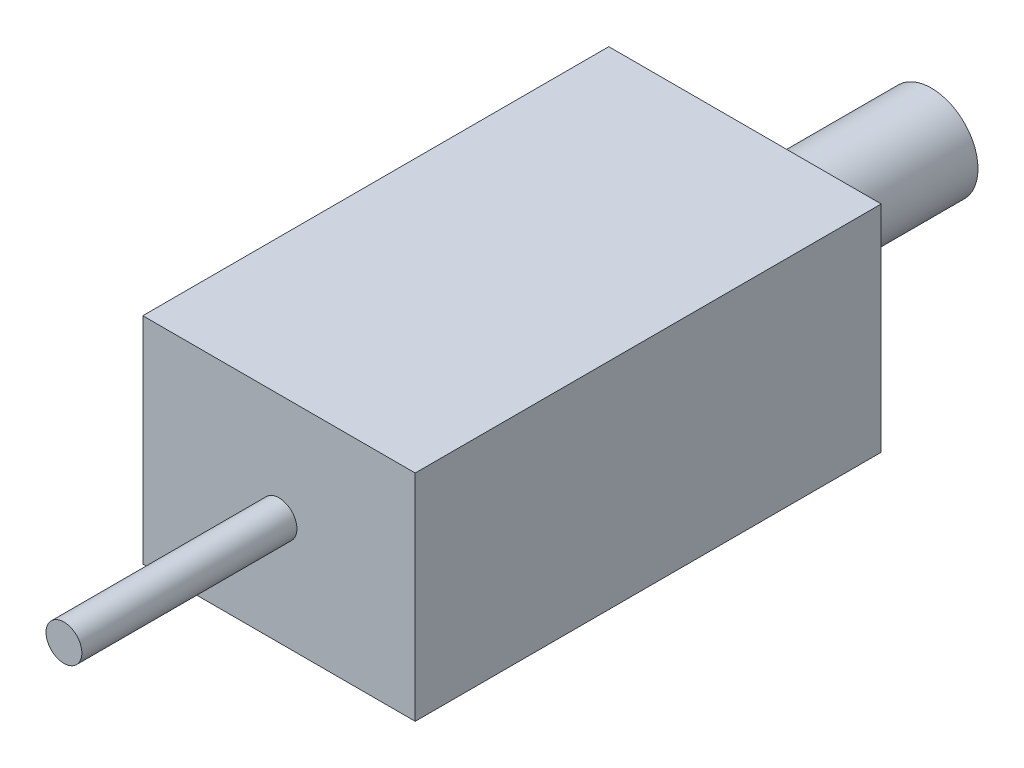
ISO-10303-21;
HEADER;
FILE_DESCRIPTION(('STEP AP214'),'2;1');
FILE_NAME('part.step','',(''),(''),'','','');
FILE_SCHEMA(('AUTOMOTIVE_DESIGN { 1 0 10303 214 1 1 1 1 }'));
ENDSEC;
DATA;
#1=APPLICATION_CONTEXT('core data for automotive mechanical design processes');
#2=APPLICATION_PROTOCOL_DEFINITION('international standard','automotive_design',2000,#1);
#3=PRODUCT_CONTEXT('',#1,'mechanical');
#4=PRODUCT('Part','Part','',(#3));
#5=PRODUCT_RELATED_PRODUCT_CATEGORY('part','',(#4));
#6=PRODUCT_DEFINITION_FORMATION('','',#4);
#7=PRODUCT_DEFINITION_CONTEXT('part definition',#1,'design');
#8=PRODUCT_DEFINITION('design','',#6,#7);
#9=PRODUCT_DEFINITION_SHAPE('','',#8);
#10=(LENGTH_UNIT() NAMED_UNIT(*) SI_UNIT(.MILLI.,.METRE.));
#11=(NAMED_UNIT(*) PLANE_ANGLE_UNIT() SI_UNIT($,.RADIAN.));
#12=(NAMED_UNIT(*) SI_UNIT($,.STERADIAN.) SOLID_ANGLE_UNIT());
#13=UNCERTAINTY_MEASURE_WITH_UNIT(LENGTH_MEASURE(1.E-05),#10,'distance_accuracy_value','');
#14=(GEOMETRIC_REPRESENTATION_CONTEXT(3) GLOBAL_UNCERTAINTY_ASSIGNED_CONTEXT((#13)) GLOBAL_UNIT_ASSIGNED_CONTEXT((#10,
#11,#12)) REPRESENTATION_CONTEXT('',''));
#15=CARTESIAN_POINT('',(0.,0.,0.));
#16=DIRECTION('',(0.,0.,1.));
#17=DIRECTION('',(1.,0.,0.));
#18=AXIS2_PLACEMENT_3D('',#15,#16,#17);
#19=CARTESIAN_POINT('',(19.,-15.,65.));
#20=DIRECTION('',(-1.,0.,0.));
#21=DIRECTION('',(0.,0.,1.));
#22=AXIS2_PLACEMENT_3D('',#19,#20,#21);
#23=PLANE('',#22);
#24=DIRECTION('',(0.,1.,0.));
#25=VECTOR('',#24,1.);
#26=CARTESIAN_POINT('',(19.,-15.,0.));
#27=LINE('',#26,#25);
#28=CARTESIAN_POINT('',(19.,-15.,0.));
#29=VERTEX_POINT('',#28);
#30=CARTESIAN_POINT('',(19.,15.,0.));
#31=VERTEX_POINT('',#30);
#32=EDGE_CURVE('E99',#29,#31,#27,.T.);
#33=ORIENTED_EDGE('',*,*,#32,.T.);
#34=DIRECTION('',(0.,0.,-1.));
#35=VECTOR('',#34,1.);
#36=CARTESIAN_POINT('',(19.,15.,65.));
#37=LINE('',#36,#35);
#38=CARTESIAN_POINT('',(19.,15.,65.));
#39=VERTEX_POINT('',#38);
#40=EDGE_CURVE('E41',#39,#31,#37,.T.);
#41=ORIENTED_EDGE('',*,*,#40,.F.);
#42=DIRECTION('',(0.,1.,0.));
#43=VECTOR('',#42,1.);
#44=CARTESIAN_POINT('',(19.,-15.,65.));
#45=LINE('',#44,#43);
#46=CARTESIAN_POINT('',(19.,-15.,65.));
#47=VERTEX_POINT('',#46);
#48=EDGE_CURVE('E85',#47,#39,#45,.T.);
#49=ORIENTED_EDGE('',*,*,#48,.F.);
#50=DIRECTION('',(0.,0.,-1.));
#51=VECTOR('',#50,1.);
#52=CARTESIAN_POINT('',(19.,-15.,65.));
#53=LINE('',#52,#51);
#54=EDGE_CURVE('E95',#47,#29,#53,.T.);
#55=ORIENTED_EDGE('',*,*,#54,.T.);
#56=EDGE_LOOP('',(#33,#41,#49,#55));
#57=FACE_BOUND('',#56,.T.);
#58=ADVANCED_FACE('F33',(#57),#23,.F.);
#59=CARTESIAN_POINT('',(-19.,15.,65.));
#60=DIRECTION('',(0.,-1.,0.));
#61=DIRECTION('',(0.,0.,-1.));
#62=AXIS2_PLACEMENT_3D('',#59,#60,#61);
#63=PLANE('',#62);
#64=DIRECTION('',(-1.,0.,0.));
#65=VECTOR('',#64,1.);
#66=CARTESIAN_POINT('',(-19.,15.,0.));
#67=LINE('',#66,#65);
#68=CARTESIAN_POINT('',(-19.,15.,0.));
#69=VERTEX_POINT('',#68);
#70=EDGE_CURVE('E90',#31,#69,#67,.T.);
#71=ORIENTED_EDGE('',*,*,#70,.T.);
#72=DIRECTION('',(0.,0.,-1.));
#73=VECTOR('',#72,1.);
#74=CARTESIAN_POINT('',(-19.,15.,65.));
#75=LINE('',#74,#73);
#76=CARTESIAN_POINT('',(-19.,15.,65.));
#77=VERTEX_POINT('',#76);
#78=EDGE_CURVE('E88',#77,#69,#75,.T.);
#79=ORIENTED_EDGE('',*,*,#78,.F.);
#80=DIRECTION('',(-1.,0.,0.));
#81=VECTOR('',#80,1.);
#82=CARTESIAN_POINT('',(-19.,15.,65.));
#83=LINE('',#82,#81);
#84=EDGE_CURVE('E80',#39,#77,#83,.T.);
#85=ORIENTED_EDGE('',*,*,#84,.F.);
#86=ORIENTED_EDGE('',*,*,#40,.T.);
#87=EDGE_LOOP('',(#71,#79,#85,#86));
#88=FACE_BOUND('',#87,.T.);
#89=ADVANCED_FACE('F89',(#88),#63,.F.);
#90=CARTESIAN_POINT('',(-19.,-15.,65.));
#91=DIRECTION('',(1.,0.,0.));
#92=DIRECTION('',(0.,0.,-1.));
#93=AXIS2_PLACEMENT_3D('',#90,#91,#92);
#94=PLANE('',#93);
#95=DIRECTION('',(0.,-1.,0.));
#96=VECTOR('',#95,1.);
#97=CARTESIAN_POINT('',(-19.,-15.,0.));
#98=LINE('',#97,#96);
#99=CARTESIAN_POINT('',(-19.,-15.,0.));
#100=VERTEX_POINT('',#99);
#101=EDGE_CURVE('E66',#69,#100,#98,.T.);
#102=ORIENTED_EDGE('',*,*,#101,.T.);
#103=DIRECTION('',(0.,0.,-1.));
#104=VECTOR('',#103,1.);
#105=CARTESIAN_POINT('',(-19.,-15.,65.));
#106=LINE('',#105,#104);
#107=CARTESIAN_POINT('',(-19.,-15.,65.));
#108=VERTEX_POINT('',#107);
#109=EDGE_CURVE('E91',#108,#100,#106,.T.);
#110=ORIENTED_EDGE('',*,*,#109,.F.);
#111=DIRECTION('',(0.,-1.,0.));
#112=VECTOR('',#111,1.);
#113=CARTESIAN_POINT('',(-19.,-15.,65.));
#114=LINE('',#113,#112);
#115=EDGE_CURVE('E83',#77,#108,#114,.T.);
#116=ORIENTED_EDGE('',*,*,#115,.F.);
#117=ORIENTED_EDGE('',*,*,#78,.T.);
#118=EDGE_LOOP('',(#102,#110,#116,#117));
#119=FACE_BOUND('',#118,.T.);
#120=ADVANCED_FACE('F93',(#119),#94,.F.);
#121=CARTESIAN_POINT('',(-19.,-15.,65.));
#122=DIRECTION('',(0.,1.,0.));
#123=DIRECTION('',(0.,0.,1.));
#124=AXIS2_PLACEMENT_3D('',#121,#122,#123);
#125=PLANE('',#124);
#126=DIRECTION('',(1.,0.,0.));
#127=VECTOR('',#126,1.);
#128=CARTESIAN_POINT('',(-19.,-15.,0.));
#129=LINE('',#128,#127);
#130=EDGE_CURVE('E72',#100,#29,#129,.T.);
#131=ORIENTED_EDGE('',*,*,#130,.T.);
#132=ORIENTED_EDGE('',*,*,#54,.F.);
#133=DIRECTION('',(1.,0.,0.));
#134=VECTOR('',#133,1.);
#135=CARTESIAN_POINT('',(-19.,-15.,65.));
#136=LINE('',#135,#134);
#137=EDGE_CURVE('E49',#108,#47,#136,.T.);
#138=ORIENTED_EDGE('',*,*,#137,.F.);
#139=ORIENTED_EDGE('',*,*,#109,.T.);
#140=EDGE_LOOP('',(#131,#132,#138,#139));
#141=FACE_BOUND('',#140,.T.);
#142=ADVANCED_FACE('F122',(#141),#125,.F.);
#143=CARTESIAN_POINT('',(0.,0.,65.));
#144=DIRECTION('',(0.,0.,-1.));
#145=DIRECTION('',(-1.,0.,0.));
#146=AXIS2_PLACEMENT_3D('',#143,#144,#145);
#147=PLANE('',#146);
#148=CARTESIAN_POINT('',(0.,0.,65.));
#149=DIRECTION('',(0.,0.,-1.));
#150=DIRECTION('',(-1.,0.,0.));
#151=AXIS2_PLACEMENT_3D('',#148,#149,#150);
#152=CIRCLE('',#151,2.5);
#153=CARTESIAN_POINT('',(-2.5,0.,65.));
#154=VERTEX_POINT('',#153);
#155=EDGE_CURVE('E11',#154,#154,#152,.F.);
#156=ORIENTED_EDGE('',*,*,#155,.F.);
#157=EDGE_LOOP('',(#156));
#158=FACE_BOUND('',#157,.T.);
#159=ORIENTED_EDGE('',*,*,#48,.T.);
#160=ORIENTED_EDGE('',*,*,#84,.T.);
#161=ORIENTED_EDGE('',*,*,#115,.T.);
#162=ORIENTED_EDGE('',*,*,#137,.T.);
#163=EDGE_LOOP('',(#159,#160,#161,#162));
#164=FACE_BOUND('',#163,.T.);
#165=ADVANCED_FACE('F81',(#158,#164),#147,.F.);
#166=CARTESIAN_POINT('',(0.,0.,0.));
#167=DIRECTION('',(0.,0.,-1.));
#168=DIRECTION('',(-1.,0.,0.));
#169=AXIS2_PLACEMENT_3D('',#166,#167,#168);
#170=PLANE('',#169);
#171=CARTESIAN_POINT('',(0.,0.,0.));
#172=DIRECTION('',(0.,0.,-1.));
#173=DIRECTION('',(-1.,0.,0.));
#174=AXIS2_PLACEMENT_3D('',#171,#172,#173);
#175=CIRCLE('',#174,6.5);
#176=CARTESIAN_POINT('',(6.5,0.,0.));
#177=VERTEX_POINT('',#176);
#178=EDGE_CURVE('E190',#177,#177,#175,.T.);
#179=ORIENTED_EDGE('',*,*,#178,.F.);
#180=EDGE_LOOP('',(#179));
#181=FACE_BOUND('',#180,.T.);
#182=ORIENTED_EDGE('',*,*,#32,.F.);
#183=ORIENTED_EDGE('',*,*,#130,.F.);
#184=ORIENTED_EDGE('',*,*,#101,.F.);
#185=ORIENTED_EDGE('',*,*,#70,.F.);
#186=EDGE_LOOP('',(#182,#183,#184,#185));
#187=FACE_BOUND('',#186,.T.);
#188=ADVANCED_FACE('F110',(#181,#187),#170,.T.);
#189=CARTESIAN_POINT('',(0.,0.,95.));
#190=DIRECTION('',(0.,0.,-1.));
#191=DIRECTION('',(-1.,0.,0.));
#192=AXIS2_PLACEMENT_3D('',#189,#190,#191);
#193=CYLINDRICAL_SURFACE('',#192,2.5);
#194=CARTESIAN_POINT('',(0.,0.,95.));
#195=DIRECTION('',(0.,0.,1.));
#196=DIRECTION('',(1.,0.,0.));
#197=AXIS2_PLACEMENT_3D('',#194,#195,#196);
#198=CIRCLE('',#197,2.5);
#199=CARTESIAN_POINT('',(2.5,0.,95.));
#200=VERTEX_POINT('',#199);
#201=EDGE_CURVE('E102',#200,#200,#198,.T.);
#202=ORIENTED_EDGE('',*,*,#201,.F.);
#203=EDGE_LOOP('',(#202));
#204=FACE_BOUND('',#203,.T.);
#205=ORIENTED_EDGE('',*,*,#155,.T.);
#206=EDGE_LOOP('',(#205));
#207=FACE_BOUND('',#206,.T.);
#208=ADVANCED_FACE('F112',(#204,#207),#193,.T.);
#209=CARTESIAN_POINT('',(0.,0.,95.));
#210=DIRECTION('',(0.,0.,1.));
#211=DIRECTION('',(1.,0.,0.));
#212=AXIS2_PLACEMENT_3D('',#209,#210,#211);
#213=PLANE('',#212);
#214=ORIENTED_EDGE('',*,*,#201,.T.);
#215=EDGE_LOOP('',(#214));
#216=FACE_BOUND('',#215,.T.);
#217=ADVANCED_FACE('F119',(#216),#213,.T.);
#218=CARTESIAN_POINT('',(0.,0.,-26.));
#219=DIRECTION('',(0.,0.,1.));
#220=DIRECTION('',(1.,0.,0.));
#221=AXIS2_PLACEMENT_3D('',#218,#219,#220);
#222=CYLINDRICAL_SURFACE('',#221,6.5);
#223=CARTESIAN_POINT('',(0.,0.,-26.));
#224=DIRECTION('',(0.,0.,-1.));
#225=DIRECTION('',(-1.,0.,0.));
#226=AXIS2_PLACEMENT_3D('',#223,#224,#225);
#227=CIRCLE('',#226,6.5);
#228=CARTESIAN_POINT('',(6.5,0.,-26.));
#229=VERTEX_POINT('',#228);
#230=EDGE_CURVE('E189',#229,#229,#227,.T.);
#231=CARTESIAN_POINT('',(6.5,0.,-26.));
#232=CARTESIAN_POINT('',(6.5,0.,-25.7291666666667));
#233=CARTESIAN_POINT('',(6.5,0.,-25.4583333333333));
#234=CARTESIAN_POINT('',(6.5,0.,-24.9166666666667));
#235=CARTESIAN_POINT('',(6.5,0.,-24.6458333333333));
#236=CARTESIAN_POINT('',(6.5,0.,-24.1041666666667));
#237=CARTESIAN_POINT('',(6.5,0.,-23.8333333333333));
#238=CARTESIAN_POINT('',(6.5,0.,-23.2916666666667));
#239=CARTESIAN_POINT('',(6.5,0.,-23.0208333333333));
#240=CARTESIAN_POINT('',(6.5,0.,-22.4791666666667));
#241=CARTESIAN_POINT('',(6.5,0.,-22.2083333333333));
#242=CARTESIAN_POINT('',(6.5,0.,-21.6666666666667));
#243=CARTESIAN_POINT('',(6.5,0.,-21.3958333333333));
#244=CARTESIAN_POINT('',(6.5,0.,-20.8541666666667));
#245=CARTESIAN_POINT('',(6.5,0.,-20.5833333333333));
#246=CARTESIAN_POINT('',(6.5,0.,-20.0416666666667));
#247=CARTESIAN_POINT('',(6.5,0.,-19.7708333333333));
#248=CARTESIAN_POINT('',(6.5,0.,-19.2291666666667));
#249=CARTESIAN_POINT('',(6.5,0.,-18.9583333333333));
#250=CARTESIAN_POINT('',(6.5,0.,-18.4166666666667));
#251=CARTESIAN_POINT('',(6.5,0.,-18.1458333333333));
#252=CARTESIAN_POINT('',(6.5,0.,-17.6041666666667));
#253=CARTESIAN_POINT('',(6.5,0.,-17.3333333333333));
#254=CARTESIAN_POINT('',(6.5,0.,-16.7916666666667));
#255=CARTESIAN_POINT('',(6.5,0.,-16.5208333333333));
#256=CARTESIAN_POINT('',(6.5,0.,-15.9791666666667));
#257=CARTESIAN_POINT('',(6.5,0.,-15.7083333333333));
#258=CARTESIAN_POINT('',(6.5,0.,-15.1666666666667));
#259=CARTESIAN_POINT('',(6.5,0.,-14.8958333333333));
#260=CARTESIAN_POINT('',(6.5,0.,-14.3541666666667));
#261=CARTESIAN_POINT('',(6.5,0.,-14.0833333333333));
#262=CARTESIAN_POINT('',(6.5,0.,-13.5416666666667));
#263=CARTESIAN_POINT('',(6.5,0.,-13.2708333333333));
#264=CARTESIAN_POINT('',(6.5,0.,-12.7291666666667));
#265=CARTESIAN_POINT('',(6.5,0.,-12.4583333333333));
#266=CARTESIAN_POINT('',(6.5,0.,-11.9166666666667));
#267=CARTESIAN_POINT('',(6.5,0.,-11.6458333333333));
#268=CARTESIAN_POINT('',(6.5,0.,-11.1041666666667));
#269=CARTESIAN_POINT('',(6.5,0.,-10.8333333333333));
#270=CARTESIAN_POINT('',(6.5,0.,-10.2916666666667));
#271=CARTESIAN_POINT('',(6.5,0.,-10.0208333333333));
#272=CARTESIAN_POINT('',(6.5,0.,-9.47916666666667));
#273=CARTESIAN_POINT('',(6.5,0.,-9.20833333333333));
#274=CARTESIAN_POINT('',(6.5,0.,-8.66666666666667));
#275=CARTESIAN_POINT('',(6.5,0.,-8.39583333333333));
#276=CARTESIAN_POINT('',(6.5,0.,-7.85416666666667));
#277=CARTESIAN_POINT('',(6.5,0.,-7.58333333333333));
#278=CARTESIAN_POINT('',(6.5,0.,-7.04166666666667));
#279=CARTESIAN_POINT('',(6.5,0.,-6.77083333333333));
#280=CARTESIAN_POINT('',(6.5,0.,-6.22916666666667));
#281=CARTESIAN_POINT('',(6.5,0.,-5.95833333333333));
#282=CARTESIAN_POINT('',(6.5,0.,-5.41666666666667));
#283=CARTESIAN_POINT('',(6.5,0.,-5.14583333333333));
#284=CARTESIAN_POINT('',(6.5,0.,-4.60416666666667));
#285=CARTESIAN_POINT('',(6.5,0.,-4.33333333333333));
#286=CARTESIAN_POINT('',(6.5,0.,-3.79166666666667));
#287=CARTESIAN_POINT('',(6.5,0.,-3.52083333333333));
#288=CARTESIAN_POINT('',(6.5,0.,-2.97916666666667));
#289=CARTESIAN_POINT('',(6.5,0.,-2.70833333333333));
#290=CARTESIAN_POINT('',(6.5,0.,-2.16666666666667));
#291=CARTESIAN_POINT('',(6.5,0.,-1.89583333333333));
#292=CARTESIAN_POINT('',(6.5,0.,-1.35416666666667));
#293=CARTESIAN_POINT('',(6.5,0.,-1.08333333333333));
#294=CARTESIAN_POINT('',(6.5,0.,-0.541666666666667));
#295=CARTESIAN_POINT('',(6.5,0.,-0.270833333333334));
#296=CARTESIAN_POINT('',(6.5,0.,0.));
#297=B_SPLINE_CURVE_WITH_KNOTS('',3,(#231,#232,#233,#234,#235,#236,#237,#238,#239,#240,#241,
#242,#243,#244,#245,#246,#247,#248,#249,#250,#251,#252,#253,#254,#255,#256,#257,#258,#259,#260,
#261,#262,#263,#264,#265,#266,#267,#268,#269,#270,#271,#272,#273,#274,#275,#276,#277,#278,#279,
#280,#281,#282,#283,#284,#285,#286,#287,#288,#289,#290,#291,#292,#293,#294,#295,#296),
.UNSPECIFIED.,.F.,.F.,(4,2,2,2,2,2,2,2,2,2,2,2,2,2,2,2,2,2,2,2,2,2,2,2,2,2,2,2,2,2,2,2,4),(0.,
0.812499999999997,1.625,2.4375,3.25,4.0625,4.875,5.6875,6.5,7.3125,8.125,8.93749999999999,
9.74999999999999,10.5625,11.375,12.1875,13.,13.8125,14.625,15.4375,16.25,17.0625,17.875,18.6875,
19.5,20.3125,21.125,21.9375,22.75,23.5625,24.375,25.1875,26.),.UNSPECIFIED.);
#298=EDGE_CURVE('BSEAM159',#229,#177,#297,.T.);
#299=ORIENTED_EDGE('',*,*,#230,.F.);
#300=ORIENTED_EDGE('',*,*,#178,.T.);
#301=ORIENTED_EDGE('',*,*,#298,.T.);
#302=ORIENTED_EDGE('',*,*,#298,.F.);
#303=EDGE_LOOP('',(#299,#301,#300,#302));
#304=FACE_BOUND('',#303,.T.);
#305=ADVANCED_FACE('F159',(#304),#222,.T.);
#306=CARTESIAN_POINT('',(0.,0.,-26.));
#307=DIRECTION('',(0.,0.,-1.));
#308=DIRECTION('',(-1.,0.,0.));
#309=AXIS2_PLACEMENT_3D('',#306,#307,#308);
#310=PLANE('',#309);
#311=ORIENTED_EDGE('',*,*,#230,.T.);
#312=EDGE_LOOP('',(#311));
#313=FACE_BOUND('',#312,.T.);
#314=ADVANCED_FACE('F173',(#313),#310,.T.);
#315=CLOSED_SHELL('',(#58,#89,#120,#142,#165,#188,#208,#217,#305,#314));
#316=MANIFOLD_SOLID_BREP('B2',#315);
#317=ADVANCED_BREP_SHAPE_REPRESENTATION('',(#18,#316),#14);
#318=SHAPE_DEFINITION_REPRESENTATION(#9,#317);
ENDSEC;
END-ISO-10303-21;
